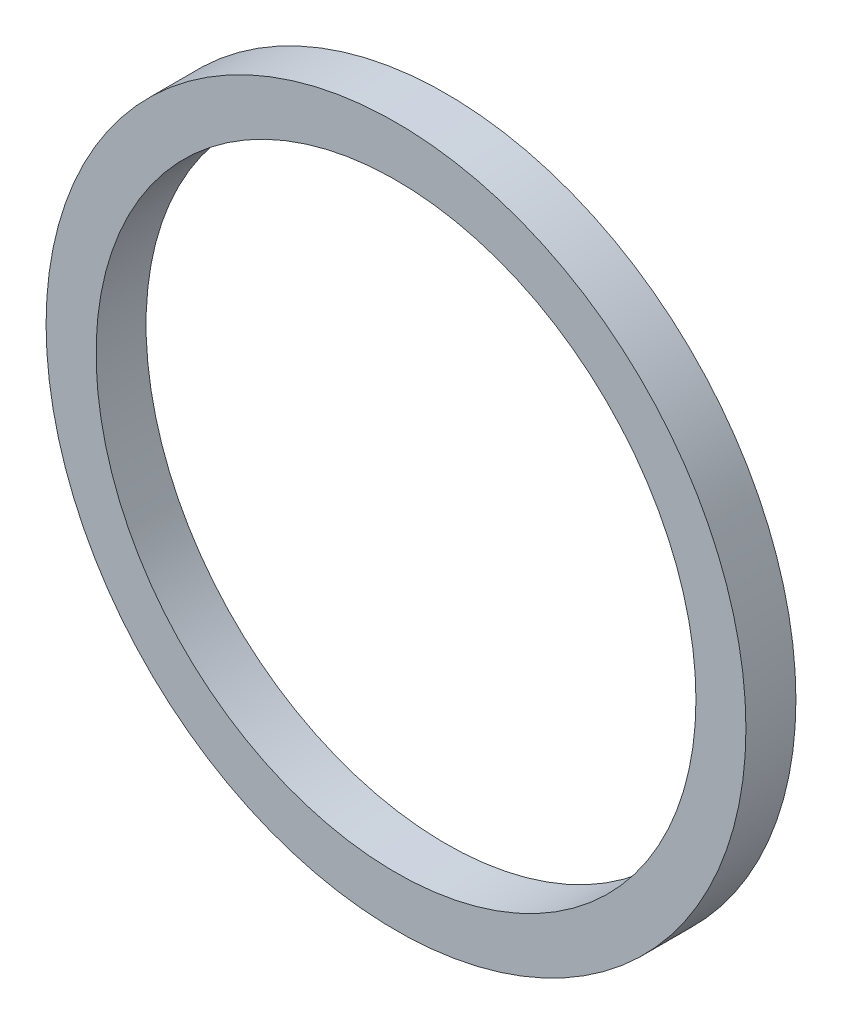
ISO-10303-21;
HEADER;
FILE_DESCRIPTION(('STEP AP214'),'2;1');
FILE_NAME('part.step','',(''),(''),'','','');
FILE_SCHEMA(('AUTOMOTIVE_DESIGN { 1 0 10303 214 1 1 1 1 }'));
ENDSEC;
DATA;
#1=APPLICATION_CONTEXT('core data for automotive mechanical design processes');
#2=APPLICATION_PROTOCOL_DEFINITION('international standard','automotive_design',2000,#1);
#3=PRODUCT_CONTEXT('',#1,'mechanical');
#4=PRODUCT('Part','Part','',(#3));
#5=PRODUCT_RELATED_PRODUCT_CATEGORY('part','',(#4));
#6=PRODUCT_DEFINITION_FORMATION('','',#4);
#7=PRODUCT_DEFINITION_CONTEXT('part definition',#1,'design');
#8=PRODUCT_DEFINITION('design','',#6,#7);
#9=PRODUCT_DEFINITION_SHAPE('','',#8);
#10=(LENGTH_UNIT() NAMED_UNIT(*) SI_UNIT(.MILLI.,.METRE.));
#11=(NAMED_UNIT(*) PLANE_ANGLE_UNIT() SI_UNIT($,.RADIAN.));
#12=(NAMED_UNIT(*) SI_UNIT($,.STERADIAN.) SOLID_ANGLE_UNIT());
#13=UNCERTAINTY_MEASURE_WITH_UNIT(LENGTH_MEASURE(1.E-05),#10,'distance_accuracy_value','');
#14=(GEOMETRIC_REPRESENTATION_CONTEXT(3) GLOBAL_UNCERTAINTY_ASSIGNED_CONTEXT((#13)) GLOBAL_UNIT_ASSIGNED_CONTEXT((#10,
#11,#12)) REPRESENTATION_CONTEXT('',''));
#15=CARTESIAN_POINT('',(0.,0.,0.));
#16=DIRECTION('',(0.,0.,1.));
#17=DIRECTION('',(1.,0.,0.));
#18=AXIS2_PLACEMENT_3D('',#15,#16,#17);
#19=CARTESIAN_POINT('',(0.,0.,2.5));
#20=DIRECTION('',(0.,0.,-1.));
#21=DIRECTION('',(-1.,0.,0.));
#22=AXIS2_PLACEMENT_3D('',#19,#20,#21);
#23=CYLINDRICAL_SURFACE('',#22,35.);
#24=CARTESIAN_POINT('',(0.,0.,2.5));
#25=DIRECTION('',(0.,0.,1.));
#26=DIRECTION('',(1.,0.,0.));
#27=AXIS2_PLACEMENT_3D('',#24,#25,#26);
#28=CIRCLE('',#27,35.);
#29=CARTESIAN_POINT('',(35.,0.,2.5));
#30=VERTEX_POINT('',#29);
#31=EDGE_CURVE('E10',#30,#30,#28,.T.);
#32=ORIENTED_EDGE('',*,*,#31,.F.);
#33=EDGE_LOOP('',(#32));
#34=FACE_BOUND('',#33,.T.);
#35=CARTESIAN_POINT('',(0.,0.,-2.5));
#36=DIRECTION('',(0.,0.,1.));
#37=DIRECTION('',(1.,0.,0.));
#38=AXIS2_PLACEMENT_3D('',#35,#36,#37);
#39=CIRCLE('',#38,35.);
#40=CARTESIAN_POINT('',(35.,0.,-2.5));
#41=VERTEX_POINT('',#40);
#42=EDGE_CURVE('E40',#41,#41,#39,.T.);
#43=ORIENTED_EDGE('',*,*,#42,.T.);
#44=EDGE_LOOP('',(#43));
#45=FACE_BOUND('',#44,.T.);
#46=ADVANCED_FACE('F37',(#34,#45),#23,.T.);
#47=CARTESIAN_POINT('',(0.,0.,2.5));
#48=DIRECTION('',(0.,0.,1.));
#49=DIRECTION('',(1.,0.,0.));
#50=AXIS2_PLACEMENT_3D('',#47,#48,#49);
#51=PLANE('',#50);
#52=CARTESIAN_POINT('',(0.,0.,2.5));
#53=DIRECTION('',(0.,0.,1.));
#54=DIRECTION('',(1.,0.,0.));
#55=AXIS2_PLACEMENT_3D('',#52,#53,#54);
#56=CIRCLE('',#55,30.);
#57=CARTESIAN_POINT('',(30.,0.,2.5));
#58=VERTEX_POINT('',#57);
#59=EDGE_CURVE('E51',#58,#58,#56,.T.);
#60=ORIENTED_EDGE('',*,*,#59,.F.);
#61=EDGE_LOOP('',(#60));
#62=FACE_BOUND('',#61,.T.);
#63=ORIENTED_EDGE('',*,*,#31,.T.);
#64=EDGE_LOOP('',(#63));
#65=FACE_BOUND('',#64,.T.);
#66=ADVANCED_FACE('F68',(#62,#65),#51,.T.);
#67=CARTESIAN_POINT('',(0.,0.,-2.5));
#68=DIRECTION('',(0.,0.,1.));
#69=DIRECTION('',(1.,0.,0.));
#70=AXIS2_PLACEMENT_3D('',#67,#68,#69);
#71=PLANE('',#70);
#72=CARTESIAN_POINT('',(0.,0.,-2.5));
#73=DIRECTION('',(0.,0.,1.));
#74=DIRECTION('',(1.,0.,0.));
#75=AXIS2_PLACEMENT_3D('',#72,#73,#74);
#76=CIRCLE('',#75,30.);
#77=CARTESIAN_POINT('',(30.,0.,-2.5));
#78=VERTEX_POINT('',#77);
#79=EDGE_CURVE('E49',#78,#78,#76,.T.);
#80=ORIENTED_EDGE('',*,*,#79,.T.);
#81=EDGE_LOOP('',(#80));
#82=FACE_BOUND('',#81,.T.);
#83=ORIENTED_EDGE('',*,*,#42,.F.);
#84=EDGE_LOOP('',(#83));
#85=FACE_BOUND('',#84,.T.);
#86=ADVANCED_FACE('F59',(#82,#85),#71,.F.);
#87=CARTESIAN_POINT('',(0.,0.,-2.5));
#88=DIRECTION('',(0.,0.,1.));
#89=DIRECTION('',(1.,0.,0.));
#90=AXIS2_PLACEMENT_3D('',#87,#88,#89);
#91=CYLINDRICAL_SURFACE('',#90,30.);
#92=ORIENTED_EDGE('',*,*,#79,.F.);
#93=EDGE_LOOP('',(#92));
#94=FACE_BOUND('',#93,.T.);
#95=ORIENTED_EDGE('',*,*,#59,.T.);
#96=EDGE_LOOP('',(#95));
#97=FACE_BOUND('',#96,.T.);
#98=ADVANCED_FACE('F62',(#94,#97),#91,.F.);
#99=CLOSED_SHELL('',(#46,#66,#86,#98));
#100=MANIFOLD_SOLID_BREP('B2',#99);
#101=ADVANCED_BREP_SHAPE_REPRESENTATION('',(#18,#100),#14);
#102=SHAPE_DEFINITION_REPRESENTATION(#9,#101);
ENDSEC;
END-ISO-10303-21;
